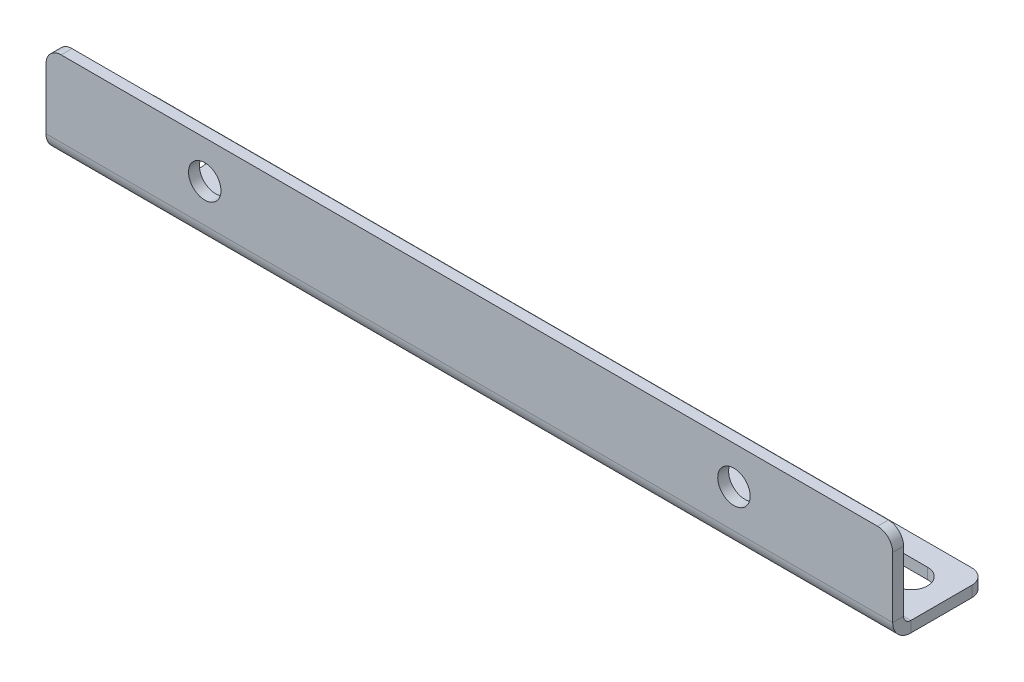
ISO-10303-21;
HEADER;
FILE_DESCRIPTION(('STEP AP214'),'2;1');
FILE_NAME('part.step','',(''),(''),'','','');
FILE_SCHEMA(('AUTOMOTIVE_DESIGN { 1 0 10303 214 1 1 1 1 }'));
ENDSEC;
DATA;
#1=APPLICATION_CONTEXT('core data for automotive mechanical design processes');
#2=APPLICATION_PROTOCOL_DEFINITION('international standard','automotive_design',2000,#1);
#3=PRODUCT_CONTEXT('',#1,'mechanical');
#4=PRODUCT('Part','Part','',(#3));
#5=PRODUCT_RELATED_PRODUCT_CATEGORY('part','',(#4));
#6=PRODUCT_DEFINITION_FORMATION('','',#4);
#7=PRODUCT_DEFINITION_CONTEXT('part definition',#1,'design');
#8=PRODUCT_DEFINITION('design','',#6,#7);
#9=PRODUCT_DEFINITION_SHAPE('','',#8);
#10=(LENGTH_UNIT() NAMED_UNIT(*) SI_UNIT(.MILLI.,.METRE.));
#11=(NAMED_UNIT(*) PLANE_ANGLE_UNIT() SI_UNIT($,.RADIAN.));
#12=(NAMED_UNIT(*) SI_UNIT($,.STERADIAN.) SOLID_ANGLE_UNIT());
#13=UNCERTAINTY_MEASURE_WITH_UNIT(LENGTH_MEASURE(1.E-05),#10,'distance_accuracy_value','');
#14=(GEOMETRIC_REPRESENTATION_CONTEXT(3) GLOBAL_UNCERTAINTY_ASSIGNED_CONTEXT((#13)) GLOBAL_UNIT_ASSIGNED_CONTEXT((#10,
#11,#12)) REPRESENTATION_CONTEXT('',''));
#15=CARTESIAN_POINT('',(0.,0.,0.));
#16=DIRECTION('',(0.,0.,1.));
#17=DIRECTION('',(1.,0.,0.));
#18=AXIS2_PLACEMENT_3D('',#15,#16,#17);
#19=CARTESIAN_POINT('',(55.5625,8.001,2.287));
#20=DIRECTION('',(0.,0.,-1.));
#21=DIRECTION('',(0.,1.,0.));
#22=AXIS2_PLACEMENT_3D('',#19,#20,#21);
#23=CYLINDRICAL_SURFACE('',#22,3.4036);
#24=CARTESIAN_POINT('',(55.5625,8.001,0.));
#25=DIRECTION('',(0.,0.,-1.));
#26=DIRECTION('',(0.,1.,0.));
#27=AXIS2_PLACEMENT_3D('',#24,#25,#26);
#28=CIRCLE('',#27,3.4036);
#29=CARTESIAN_POINT('',(55.5625,11.4046,0.));
#30=VERTEX_POINT('',#29);
#31=EDGE_CURVE('E318',#30,#30,#28,.T.);
#32=ORIENTED_EDGE('',*,*,#31,.T.);
#33=EDGE_LOOP('',(#32));
#34=FACE_BOUND('',#33,.T.);
#35=CARTESIAN_POINT('',(55.5625,8.001,2.286));
#36=DIRECTION('',(0.,0.,-1.));
#37=DIRECTION('',(0.,1.,0.));
#38=AXIS2_PLACEMENT_3D('',#35,#36,#37);
#39=CIRCLE('',#38,3.4036);
#40=CARTESIAN_POINT('',(55.5625,11.4046,2.286));
#41=VERTEX_POINT('',#40);
#42=EDGE_CURVE('E338',#41,#41,#39,.F.);
#43=ORIENTED_EDGE('',*,*,#42,.T.);
#44=EDGE_LOOP('',(#43));
#45=FACE_BOUND('',#44,.T.);
#46=ADVANCED_FACE('F40',(#34,#45),#23,.F.);
#47=CARTESIAN_POINT('',(88.9,15.9258,2.286));
#48=DIRECTION('',(0.,0.,-1.));
#49=DIRECTION('',(0.,1.,0.));
#50=AXIS2_PLACEMENT_3D('',#47,#48,#49);
#51=PLANE('',#50);
#52=CARTESIAN_POINT('',(-55.5625,8.00099999999999,2.286));
#53=DIRECTION('',(0.,0.,-1.));
#54=DIRECTION('',(0.,1.,0.));
#55=AXIS2_PLACEMENT_3D('',#52,#53,#54);
#56=CIRCLE('',#55,3.4036);
#57=CARTESIAN_POINT('',(-55.5625,11.4046,2.286));
#58=VERTEX_POINT('',#57);
#59=EDGE_CURVE('E335',#58,#58,#56,.F.);
#60=ORIENTED_EDGE('',*,*,#59,.F.);
#61=EDGE_LOOP('',(#60));
#62=FACE_BOUND('',#61,.T.);
#63=ORIENTED_EDGE('',*,*,#42,.F.);
#64=EDGE_LOOP('',(#63));
#65=FACE_BOUND('',#64,.T.);
#66=DIRECTION('',(-1.,0.,0.));
#67=VECTOR('',#66,1.);
#68=CARTESIAN_POINT('',(88.9,15.9258,2.286));
#69=LINE('',#68,#67);
#70=CARTESIAN_POINT('',(85.72,15.9258,2.286));
#71=VERTEX_POINT('',#70);
#72=CARTESIAN_POINT('',(-85.72,15.9258,2.286));
#73=VERTEX_POINT('',#72);
#74=EDGE_CURVE('E341',#71,#73,#69,.T.);
#75=ORIENTED_EDGE('',*,*,#74,.T.);
#76=CARTESIAN_POINT('',(-85.72,12.7458,2.286));
#77=DIRECTION('',(0.,0.,-1.));
#78=DIRECTION('',(0.,1.,0.));
#79=AXIS2_PLACEMENT_3D('',#76,#77,#78);
#80=CIRCLE('',#79,3.18);
#81=CARTESIAN_POINT('',(-88.9,12.7458,2.286));
#82=VERTEX_POINT('',#81);
#83=EDGE_CURVE('E343',#73,#82,#80,.F.);
#84=ORIENTED_EDGE('',*,*,#83,.T.);
#85=DIRECTION('',(0.,-1.,0.));
#86=VECTOR('',#85,1.);
#87=CARTESIAN_POINT('',(-88.9,15.9258,2.286));
#88=LINE('',#87,#86);
#89=CARTESIAN_POINT('',(-88.9,0.,2.286));
#90=VERTEX_POINT('',#89);
#91=EDGE_CURVE('E345',#82,#90,#88,.T.);
#92=ORIENTED_EDGE('',*,*,#91,.T.);
#93=DIRECTION('',(-1.,0.,0.));
#94=VECTOR('',#93,1.);
#95=CARTESIAN_POINT('',(88.9,0.,2.286));
#96=LINE('',#95,#94);
#97=CARTESIAN_POINT('',(88.9,0.,2.286));
#98=VERTEX_POINT('',#97);
#99=EDGE_CURVE('E196',#98,#90,#96,.T.);
#100=ORIENTED_EDGE('',*,*,#99,.F.);
#101=DIRECTION('',(0.,-1.,0.));
#102=VECTOR('',#101,1.);
#103=CARTESIAN_POINT('',(88.9,15.9258,2.286));
#104=LINE('',#103,#102);
#105=CARTESIAN_POINT('',(88.9,12.7458,2.286));
#106=VERTEX_POINT('',#105);
#107=EDGE_CURVE('E60',#106,#98,#104,.T.);
#108=ORIENTED_EDGE('',*,*,#107,.F.);
#109=CARTESIAN_POINT('',(85.72,12.7458,2.286));
#110=DIRECTION('',(0.,0.,-1.));
#111=DIRECTION('',(0.,1.,0.));
#112=AXIS2_PLACEMENT_3D('',#109,#110,#111);
#113=CIRCLE('',#112,3.18);
#114=EDGE_CURVE('E55',#106,#71,#113,.F.);
#115=ORIENTED_EDGE('',*,*,#114,.T.);
#116=EDGE_LOOP('',(#75,#84,#92,#100,#108,#115));
#117=FACE_BOUND('',#116,.T.);
#118=ADVANCED_FACE('F372',(#62,#65,#117),#51,.F.);
#119=CARTESIAN_POINT('',(-55.5625,8.00099999999999,2.287));
#120=DIRECTION('',(0.,0.,-1.));
#121=DIRECTION('',(0.,1.,0.));
#122=AXIS2_PLACEMENT_3D('',#119,#120,#121);
#123=CYLINDRICAL_SURFACE('',#122,3.4036);
#124=CARTESIAN_POINT('',(-55.5625,8.00099999999999,0.));
#125=DIRECTION('',(0.,0.,-1.));
#126=DIRECTION('',(0.,-1.,0.));
#127=AXIS2_PLACEMENT_3D('',#124,#125,#126);
#128=CIRCLE('',#127,3.4036);
#129=CARTESIAN_POINT('',(-55.5625,4.59739999999999,0.));
#130=VERTEX_POINT('',#129);
#131=EDGE_CURVE('E217',#130,#130,#128,.T.);
#132=ORIENTED_EDGE('',*,*,#131,.T.);
#133=EDGE_LOOP('',(#132));
#134=FACE_BOUND('',#133,.T.);
#135=ORIENTED_EDGE('',*,*,#59,.T.);
#136=EDGE_LOOP('',(#135));
#137=FACE_BOUND('',#136,.T.);
#138=ADVANCED_FACE('F395',(#134,#137),#123,.F.);
#139=CARTESIAN_POINT('',(88.9,15.9258,0.));
#140=DIRECTION('',(0.,0.,1.));
#141=DIRECTION('',(0.,-1.,0.));
#142=AXIS2_PLACEMENT_3D('',#139,#140,#141);
#143=PLANE('',#142);
#144=ORIENTED_EDGE('',*,*,#131,.F.);
#145=EDGE_LOOP('',(#144));
#146=FACE_BOUND('',#145,.T.);
#147=ORIENTED_EDGE('',*,*,#31,.F.);
#148=EDGE_LOOP('',(#147));
#149=FACE_BOUND('',#148,.T.);
#150=DIRECTION('',(0.,1.,0.));
#151=VECTOR('',#150,1.);
#152=CARTESIAN_POINT('',(-88.9,15.9258,0.));
#153=LINE('',#152,#151);
#154=CARTESIAN_POINT('',(-88.9,0.,0.));
#155=VERTEX_POINT('',#154);
#156=CARTESIAN_POINT('',(-88.9,12.7458,0.));
#157=VERTEX_POINT('',#156);
#158=EDGE_CURVE('E321',#155,#157,#153,.T.);
#159=ORIENTED_EDGE('',*,*,#158,.T.);
#160=CARTESIAN_POINT('',(-85.72,12.7458,0.));
#161=DIRECTION('',(0.,0.,1.));
#162=DIRECTION('',(0.,-1.,0.));
#163=AXIS2_PLACEMENT_3D('',#160,#161,#162);
#164=CIRCLE('',#163,3.18);
#165=CARTESIAN_POINT('',(-85.72,15.9258,0.));
#166=VERTEX_POINT('',#165);
#167=EDGE_CURVE('E323',#157,#166,#164,.F.);
#168=ORIENTED_EDGE('',*,*,#167,.T.);
#169=DIRECTION('',(-1.,0.,0.));
#170=VECTOR('',#169,1.);
#171=CARTESIAN_POINT('',(88.9,15.9258,0.));
#172=LINE('',#171,#170);
#173=CARTESIAN_POINT('',(85.72,15.9258,0.));
#174=VERTEX_POINT('',#173);
#175=EDGE_CURVE('E325',#174,#166,#172,.T.);
#176=ORIENTED_EDGE('',*,*,#175,.F.);
#177=CARTESIAN_POINT('',(85.72,12.7458,0.));
#178=DIRECTION('',(0.,0.,1.));
#179=DIRECTION('',(0.,-1.,0.));
#180=AXIS2_PLACEMENT_3D('',#177,#178,#179);
#181=CIRCLE('',#180,3.18);
#182=CARTESIAN_POINT('',(88.9,12.7458,0.));
#183=VERTEX_POINT('',#182);
#184=EDGE_CURVE('E328',#174,#183,#181,.F.);
#185=ORIENTED_EDGE('',*,*,#184,.T.);
#186=DIRECTION('',(0.,1.,0.));
#187=VECTOR('',#186,1.);
#188=CARTESIAN_POINT('',(88.9,15.9258,0.));
#189=LINE('',#188,#187);
#190=CARTESIAN_POINT('',(88.9,0.,0.));
#191=VERTEX_POINT('',#190);
#192=EDGE_CURVE('E330',#191,#183,#189,.T.);
#193=ORIENTED_EDGE('',*,*,#192,.F.);
#194=DIRECTION('',(-1.,0.,0.));
#195=VECTOR('',#194,1.);
#196=CARTESIAN_POINT('',(88.9,0.,0.));
#197=LINE('',#196,#195);
#198=EDGE_CURVE('E333',#191,#155,#197,.T.);
#199=ORIENTED_EDGE('',*,*,#198,.T.);
#200=EDGE_LOOP('',(#159,#168,#176,#185,#193,#199));
#201=FACE_BOUND('',#200,.T.);
#202=ADVANCED_FACE('F393',(#146,#149,#201),#143,.F.);
#203=CARTESIAN_POINT('',(-88.9,15.9258,-357.023646867487));
#204=DIRECTION('',(1.,0.,0.));
#205=DIRECTION('',(0.,-1.,0.));
#206=AXIS2_PLACEMENT_3D('',#203,#204,#205);
#207=PLANE('',#206);
#208=DIRECTION('',(0.,0.,1.));
#209=VECTOR('',#208,1.);
#210=CARTESIAN_POINT('',(-88.9,0.,-357.023646867487));
#211=LINE('',#210,#209);
#212=EDGE_CURVE('E351',#155,#90,#211,.T.);
#213=ORIENTED_EDGE('',*,*,#212,.T.);
#214=ORIENTED_EDGE('',*,*,#91,.F.);
#215=DIRECTION('',(0.,0.,1.));
#216=VECTOR('',#215,1.);
#217=CARTESIAN_POINT('',(-88.9,12.7458,-357.023646867487));
#218=LINE('',#217,#216);
#219=EDGE_CURVE('E11',#157,#82,#218,.T.);
#220=ORIENTED_EDGE('',*,*,#219,.F.);
#221=ORIENTED_EDGE('',*,*,#158,.F.);
#222=EDGE_LOOP('',(#213,#214,#220,#221));
#223=FACE_BOUND('',#222,.T.);
#224=ADVANCED_FACE('F42',(#223),#207,.F.);
#225=CARTESIAN_POINT('',(-85.72,12.7458,-357.023646867487));
#226=DIRECTION('',(0.,0.,1.));
#227=DIRECTION('',(0.,-1.,0.));
#228=AXIS2_PLACEMENT_3D('',#225,#226,#227);
#229=CYLINDRICAL_SURFACE('',#228,3.18);
#230=ORIENTED_EDGE('',*,*,#219,.T.);
#231=ORIENTED_EDGE('',*,*,#83,.F.);
#232=DIRECTION('',(0.,0.,1.));
#233=VECTOR('',#232,1.);
#234=CARTESIAN_POINT('',(-85.72,15.9258,-357.023646867487));
#235=LINE('',#234,#233);
#236=EDGE_CURVE('E48',#166,#73,#235,.T.);
#237=ORIENTED_EDGE('',*,*,#236,.F.);
#238=ORIENTED_EDGE('',*,*,#167,.F.);
#239=EDGE_LOOP('',(#230,#231,#237,#238));
#240=FACE_BOUND('',#239,.T.);
#241=ADVANCED_FACE('F369',(#240),#229,.T.);
#242=CARTESIAN_POINT('',(88.9,15.9258,-357.023646867487));
#243=DIRECTION('',(0.,1.,0.));
#244=DIRECTION('',(0.,0.,1.));
#245=AXIS2_PLACEMENT_3D('',#242,#243,#244);
#246=PLANE('',#245);
#247=ORIENTED_EDGE('',*,*,#74,.F.);
#248=DIRECTION('',(0.,0.,1.));
#249=VECTOR('',#248,1.);
#250=CARTESIAN_POINT('',(85.72,15.9258,-357.023646867487));
#251=LINE('',#250,#249);
#252=EDGE_CURVE('E359',#174,#71,#251,.T.);
#253=ORIENTED_EDGE('',*,*,#252,.F.);
#254=ORIENTED_EDGE('',*,*,#175,.T.);
#255=ORIENTED_EDGE('',*,*,#236,.T.);
#256=EDGE_LOOP('',(#247,#253,#254,#255));
#257=FACE_BOUND('',#256,.T.);
#258=ADVANCED_FACE('F364',(#257),#246,.T.);
#259=CARTESIAN_POINT('',(85.72,12.7458,-357.023646867487));
#260=DIRECTION('',(0.,0.,1.));
#261=DIRECTION('',(0.,-1.,0.));
#262=AXIS2_PLACEMENT_3D('',#259,#260,#261);
#263=CYLINDRICAL_SURFACE('',#262,3.18);
#264=ORIENTED_EDGE('',*,*,#252,.T.);
#265=ORIENTED_EDGE('',*,*,#114,.F.);
#266=DIRECTION('',(0.,0.,1.));
#267=VECTOR('',#266,1.);
#268=CARTESIAN_POINT('',(88.9,12.7458,-357.023646867487));
#269=LINE('',#268,#267);
#270=EDGE_CURVE('E356',#183,#106,#269,.T.);
#271=ORIENTED_EDGE('',*,*,#270,.F.);
#272=ORIENTED_EDGE('',*,*,#184,.F.);
#273=EDGE_LOOP('',(#264,#265,#271,#272));
#274=FACE_BOUND('',#273,.T.);
#275=ADVANCED_FACE('F391',(#274),#263,.T.);
#276=CARTESIAN_POINT('',(88.9,15.9258,-357.023646867487));
#277=DIRECTION('',(1.,0.,0.));
#278=DIRECTION('',(0.,-1.,0.));
#279=AXIS2_PLACEMENT_3D('',#276,#277,#278);
#280=PLANE('',#279);
#281=ORIENTED_EDGE('',*,*,#107,.T.);
#282=DIRECTION('',(0.,0.,1.));
#283=VECTOR('',#282,1.);
#284=CARTESIAN_POINT('',(88.9,0.,-357.023646867487));
#285=LINE('',#284,#283);
#286=EDGE_CURVE('E353',#191,#98,#285,.T.);
#287=ORIENTED_EDGE('',*,*,#286,.F.);
#288=ORIENTED_EDGE('',*,*,#192,.T.);
#289=ORIENTED_EDGE('',*,*,#270,.T.);
#290=EDGE_LOOP('',(#281,#287,#288,#289));
#291=FACE_BOUND('',#290,.T.);
#292=ADVANCED_FACE('F387',(#291),#280,.T.);
#293=CARTESIAN_POINT('',(85.72,355.508725377156,-14.3205999999999));
#294=DIRECTION('',(0.,-1.,0.));
#295=DIRECTION('',(0.,0.,-1.));
#296=AXIS2_PLACEMENT_3D('',#293,#294,#295);
#297=CYLINDRICAL_SURFACE('',#296,3.18);
#298=DIRECTION('',(0.,-1.,0.));
#299=VECTOR('',#298,1.);
#300=CARTESIAN_POINT('',(88.9,355.508725377156,-14.3205999999999));
#301=LINE('',#300,#299);
#302=CARTESIAN_POINT('',(88.9,-1.52399999999997,-14.3206));
#303=VERTEX_POINT('',#302);
#304=CARTESIAN_POINT('',(88.9,-3.81,-14.3206));
#305=VERTEX_POINT('',#304);
#306=EDGE_CURVE('E186',#303,#305,#301,.T.);
#307=ORIENTED_EDGE('',*,*,#306,.T.);
#308=CARTESIAN_POINT('',(85.72,-3.81,-14.3206));
#309=DIRECTION('',(0.,1.,0.));
#310=DIRECTION('',(0.,0.,1.));
#311=AXIS2_PLACEMENT_3D('',#308,#309,#310);
#312=CIRCLE('',#311,3.18);
#313=CARTESIAN_POINT('',(85.72,-3.80999999999998,-17.5006));
#314=VERTEX_POINT('',#313);
#315=EDGE_CURVE('E215',#314,#305,#312,.F.);
#316=ORIENTED_EDGE('',*,*,#315,.F.);
#317=DIRECTION('',(0.,-1.,0.));
#318=VECTOR('',#317,1.);
#319=CARTESIAN_POINT('',(85.72,355.508725377156,-17.5005999999999));
#320=LINE('',#319,#318);
#321=CARTESIAN_POINT('',(85.72,-1.524,-17.5006));
#322=VERTEX_POINT('',#321);
#323=EDGE_CURVE('E307',#322,#314,#320,.T.);
#324=ORIENTED_EDGE('',*,*,#323,.F.);
#325=CARTESIAN_POINT('',(85.72,-1.524,-14.3206));
#326=DIRECTION('',(0.,-1.,0.));
#327=DIRECTION('',(0.,0.,-1.));
#328=AXIS2_PLACEMENT_3D('',#325,#326,#327);
#329=CIRCLE('',#328,3.18);
#330=EDGE_CURVE('E228',#303,#322,#329,.F.);
#331=ORIENTED_EDGE('',*,*,#330,.F.);
#332=EDGE_LOOP('',(#307,#316,#324,#331));
#333=FACE_BOUND('',#332,.T.);
#334=ADVANCED_FACE('F417',(#333),#297,.T.);
#335=CARTESIAN_POINT('',(-85.72,355.508725377156,-14.3205999999999));
#336=DIRECTION('',(0.,-1.,0.));
#337=DIRECTION('',(0.,0.,-1.));
#338=AXIS2_PLACEMENT_3D('',#335,#336,#337);
#339=CYLINDRICAL_SURFACE('',#338,3.18);
#340=DIRECTION('',(0.,-1.,0.));
#341=VECTOR('',#340,1.);
#342=CARTESIAN_POINT('',(-85.72,355.508725377156,-17.5005999999999));
#343=LINE('',#342,#341);
#344=CARTESIAN_POINT('',(-85.72,-1.524,-17.5006));
#345=VERTEX_POINT('',#344);
#346=CARTESIAN_POINT('',(-85.72,-3.81,-17.5006));
#347=VERTEX_POINT('',#346);
#348=EDGE_CURVE('E310',#345,#347,#343,.T.);
#349=ORIENTED_EDGE('',*,*,#348,.T.);
#350=CARTESIAN_POINT('',(-85.72,-3.81,-14.3206));
#351=DIRECTION('',(0.,1.,0.));
#352=DIRECTION('',(0.,0.,1.));
#353=AXIS2_PLACEMENT_3D('',#350,#351,#352);
#354=CIRCLE('',#353,3.18);
#355=CARTESIAN_POINT('',(-88.9,-3.81,-14.3206));
#356=VERTEX_POINT('',#355);
#357=EDGE_CURVE('E207',#356,#347,#354,.F.);
#358=ORIENTED_EDGE('',*,*,#357,.F.);
#359=DIRECTION('',(0.,-1.,0.));
#360=VECTOR('',#359,1.);
#361=CARTESIAN_POINT('',(-88.9,355.508725377156,-14.3205999999999));
#362=LINE('',#361,#360);
#363=CARTESIAN_POINT('',(-88.9,-1.524,-14.3206));
#364=VERTEX_POINT('',#363);
#365=EDGE_CURVE('E204',#364,#356,#362,.T.);
#366=ORIENTED_EDGE('',*,*,#365,.F.);
#367=CARTESIAN_POINT('',(-85.72,-1.524,-14.3206));
#368=DIRECTION('',(0.,-1.,0.));
#369=DIRECTION('',(0.,0.,-1.));
#370=AXIS2_PLACEMENT_3D('',#367,#368,#369);
#371=CIRCLE('',#370,3.18);
#372=EDGE_CURVE('E233',#345,#364,#371,.F.);
#373=ORIENTED_EDGE('',*,*,#372,.F.);
#374=EDGE_LOOP('',(#349,#358,#366,#373));
#375=FACE_BOUND('',#374,.T.);
#376=ADVANCED_FACE('F444',(#375),#339,.T.);
#377=CARTESIAN_POINT('',(88.9,355.508725377156,-17.5005999999999));
#378=DIRECTION('',(0.,0.,1.));
#379=DIRECTION('',(0.,-1.,0.));
#380=AXIS2_PLACEMENT_3D('',#377,#378,#379);
#381=PLANE('',#380);
#382=ORIENTED_EDGE('',*,*,#323,.T.);
#383=DIRECTION('',(-1.,0.,0.));
#384=VECTOR('',#383,1.);
#385=CARTESIAN_POINT('',(88.9,-3.81,-17.5006));
#386=LINE('',#385,#384);
#387=EDGE_CURVE('E304',#314,#347,#386,.T.);
#388=ORIENTED_EDGE('',*,*,#387,.T.);
#389=ORIENTED_EDGE('',*,*,#348,.F.);
#390=DIRECTION('',(-1.,0.,0.));
#391=VECTOR('',#390,1.);
#392=CARTESIAN_POINT('',(88.9,-1.524,-17.5006));
#393=LINE('',#392,#391);
#394=EDGE_CURVE('E235',#322,#345,#393,.T.);
#395=ORIENTED_EDGE('',*,*,#394,.F.);
#396=EDGE_LOOP('',(#382,#388,#389,#395));
#397=FACE_BOUND('',#396,.T.);
#398=ADVANCED_FACE('F452',(#397),#381,.F.);
#399=CARTESIAN_POINT('',(71.4375,-3.811,-9.56309999999998));
#400=DIRECTION('',(0.,1.,0.));
#401=DIRECTION('',(0.,0.,1.));
#402=AXIS2_PLACEMENT_3D('',#399,#400,#401);
#403=CYLINDRICAL_SURFACE('',#402,3.4036);
#404=CARTESIAN_POINT('',(71.4375,-3.81,-9.56309999999998));
#405=DIRECTION('',(0.,1.,0.));
#406=DIRECTION('',(0.,0.,1.));
#407=AXIS2_PLACEMENT_3D('',#404,#405,#406);
#408=CIRCLE('',#407,3.4036);
#409=CARTESIAN_POINT('',(71.4375,-3.81,-6.15949999999998));
#410=VERTEX_POINT('',#409);
#411=CARTESIAN_POINT('',(71.4375,-3.81,-12.9667));
#412=VERTEX_POINT('',#411);
#413=EDGE_CURVE('E301',#410,#412,#408,.F.);
#414=ORIENTED_EDGE('',*,*,#413,.T.);
#415=DIRECTION('',(0.,1.,0.));
#416=VECTOR('',#415,1.);
#417=CARTESIAN_POINT('',(71.4375,-3.811,-12.9667));
#418=LINE('',#417,#416);
#419=CARTESIAN_POINT('',(71.4375,-1.524,-12.9667));
#420=VERTEX_POINT('',#419);
#421=EDGE_CURVE('E298',#412,#420,#418,.T.);
#422=ORIENTED_EDGE('',*,*,#421,.T.);
#423=CARTESIAN_POINT('',(71.4375,-1.524,-9.56309999999998));
#424=DIRECTION('',(0.,1.,0.));
#425=DIRECTION('',(0.,0.,1.));
#426=AXIS2_PLACEMENT_3D('',#423,#424,#425);
#427=CIRCLE('',#426,3.4036);
#428=CARTESIAN_POINT('',(71.4375,-1.524,-6.15949999999998));
#429=VERTEX_POINT('',#428);
#430=EDGE_CURVE('E295',#420,#429,#427,.T.);
#431=ORIENTED_EDGE('',*,*,#430,.T.);
#432=DIRECTION('',(0.,1.,0.));
#433=VECTOR('',#432,1.);
#434=CARTESIAN_POINT('',(71.4375,-3.811,-6.15949999999998));
#435=LINE('',#434,#433);
#436=EDGE_CURVE('E290',#410,#429,#435,.T.);
#437=ORIENTED_EDGE('',*,*,#436,.F.);
#438=EDGE_LOOP('',(#414,#422,#431,#437));
#439=FACE_BOUND('',#438,.T.);
#440=ADVANCED_FACE('F460',(#439),#403,.F.);
#441=CARTESIAN_POINT('',(71.4375,-3.811,-6.15949999999998));
#442=DIRECTION('',(0.,0.,1.));
#443=DIRECTION('',(0.,-1.,0.));
#444=AXIS2_PLACEMENT_3D('',#441,#442,#443);
#445=PLANE('',#444);
#446=DIRECTION('',(-1.,0.,0.));
#447=VECTOR('',#446,1.);
#448=CARTESIAN_POINT('',(71.4375,-3.81,-6.15949999999998));
#449=LINE('',#448,#447);
#450=CARTESIAN_POINT('',(80.9625,-3.81,-6.15949999999998));
#451=VERTEX_POINT('',#450);
#452=EDGE_CURVE('E293',#451,#410,#449,.T.);
#453=ORIENTED_EDGE('',*,*,#452,.T.);
#454=ORIENTED_EDGE('',*,*,#436,.T.);
#455=DIRECTION('',(1.,0.,0.));
#456=VECTOR('',#455,1.);
#457=CARTESIAN_POINT('',(71.4375,-1.524,-6.15949999999998));
#458=LINE('',#457,#456);
#459=CARTESIAN_POINT('',(80.9625,-1.524,-6.15949999999998));
#460=VERTEX_POINT('',#459);
#461=EDGE_CURVE('E287',#429,#460,#458,.T.);
#462=ORIENTED_EDGE('',*,*,#461,.T.);
#463=DIRECTION('',(0.,1.,0.));
#464=VECTOR('',#463,1.);
#465=CARTESIAN_POINT('',(80.9625,-3.811,-6.15949999999998));
#466=LINE('',#465,#464);
#467=EDGE_CURVE('E281',#451,#460,#466,.T.);
#468=ORIENTED_EDGE('',*,*,#467,.F.);
#469=EDGE_LOOP('',(#453,#454,#462,#468));
#470=FACE_BOUND('',#469,.T.);
#471=ADVANCED_FACE('F468',(#470),#445,.F.);
#472=CARTESIAN_POINT('',(80.9625,-3.811,-9.56309999999998));
#473=DIRECTION('',(0.,1.,0.));
#474=DIRECTION('',(0.,0.,1.));
#475=AXIS2_PLACEMENT_3D('',#472,#473,#474);
#476=CYLINDRICAL_SURFACE('',#475,3.4036);
#477=CARTESIAN_POINT('',(80.9625,-3.81,-9.56309999999998));
#478=DIRECTION('',(0.,1.,0.));
#479=DIRECTION('',(0.,0.,1.));
#480=AXIS2_PLACEMENT_3D('',#477,#478,#479);
#481=CIRCLE('',#480,3.4036);
#482=CARTESIAN_POINT('',(80.9625,-3.81,-12.9667));
#483=VERTEX_POINT('',#482);
#484=EDGE_CURVE('E284',#483,#451,#481,.F.);
#485=ORIENTED_EDGE('',*,*,#484,.T.);
#486=ORIENTED_EDGE('',*,*,#467,.T.);
#487=CARTESIAN_POINT('',(80.9625,-1.524,-9.56309999999998));
#488=DIRECTION('',(0.,1.,0.));
#489=DIRECTION('',(0.,0.,1.));
#490=AXIS2_PLACEMENT_3D('',#487,#488,#489);
#491=CIRCLE('',#490,3.4036);
#492=CARTESIAN_POINT('',(80.9625,-1.524,-12.9667));
#493=VERTEX_POINT('',#492);
#494=EDGE_CURVE('E278',#460,#493,#491,.T.);
#495=ORIENTED_EDGE('',*,*,#494,.T.);
#496=DIRECTION('',(0.,1.,0.));
#497=VECTOR('',#496,1.);
#498=CARTESIAN_POINT('',(80.9625,-3.811,-12.9667));
#499=LINE('',#498,#497);
#500=EDGE_CURVE('E272',#483,#493,#499,.T.);
#501=ORIENTED_EDGE('',*,*,#500,.F.);
#502=EDGE_LOOP('',(#485,#486,#495,#501));
#503=FACE_BOUND('',#502,.T.);
#504=ADVANCED_FACE('F476',(#503),#476,.F.);
#505=CARTESIAN_POINT('',(80.9625,-3.811,-12.9667));
#506=DIRECTION('',(0.,0.,-1.));
#507=DIRECTION('',(-1.,0.,0.));
#508=AXIS2_PLACEMENT_3D('',#505,#506,#507);
#509=PLANE('',#508);
#510=DIRECTION('',(1.,0.,0.));
#511=VECTOR('',#510,1.);
#512=CARTESIAN_POINT('',(80.9625,-3.81,-12.9667));
#513=LINE('',#512,#511);
#514=EDGE_CURVE('E275',#412,#483,#513,.T.);
#515=ORIENTED_EDGE('',*,*,#514,.T.);
#516=ORIENTED_EDGE('',*,*,#500,.T.);
#517=DIRECTION('',(-1.,0.,0.));
#518=VECTOR('',#517,1.);
#519=CARTESIAN_POINT('',(80.9625,-1.524,-12.9667));
#520=LINE('',#519,#518);
#521=EDGE_CURVE('E270',#493,#420,#520,.T.);
#522=ORIENTED_EDGE('',*,*,#521,.T.);
#523=ORIENTED_EDGE('',*,*,#421,.F.);
#524=EDGE_LOOP('',(#515,#516,#522,#523));
#525=FACE_BOUND('',#524,.T.);
#526=ADVANCED_FACE('F484',(#525),#509,.F.);
#527=CARTESIAN_POINT('',(-80.9625,-3.811,-9.56309999999998));
#528=DIRECTION('',(0.,1.,0.));
#529=DIRECTION('',(0.,0.,1.));
#530=AXIS2_PLACEMENT_3D('',#527,#528,#529);
#531=CYLINDRICAL_SURFACE('',#530,3.4036);
#532=CARTESIAN_POINT('',(-80.9625,-3.81,-9.56309999999998));
#533=DIRECTION('',(0.,1.,0.));
#534=DIRECTION('',(0.,0.,1.));
#535=AXIS2_PLACEMENT_3D('',#532,#533,#534);
#536=CIRCLE('',#535,3.4036);
#537=CARTESIAN_POINT('',(-80.9625,-3.81,-6.15949999999998));
#538=VERTEX_POINT('',#537);
#539=CARTESIAN_POINT('',(-80.9625,-3.81,-12.9667));
#540=VERTEX_POINT('',#539);
#541=EDGE_CURVE('E267',#538,#540,#536,.F.);
#542=ORIENTED_EDGE('',*,*,#541,.T.);
#543=DIRECTION('',(0.,1.,0.));
#544=VECTOR('',#543,1.);
#545=CARTESIAN_POINT('',(-80.9625,-3.811,-12.9667));
#546=LINE('',#545,#544);
#547=CARTESIAN_POINT('',(-80.9625,-1.524,-12.9667));
#548=VERTEX_POINT('',#547);
#549=EDGE_CURVE('E264',#540,#548,#546,.T.);
#550=ORIENTED_EDGE('',*,*,#549,.T.);
#551=CARTESIAN_POINT('',(-80.9625,-1.524,-9.56309999999998));
#552=DIRECTION('',(0.,1.,0.));
#553=DIRECTION('',(0.,0.,-1.));
#554=AXIS2_PLACEMENT_3D('',#551,#552,#553);
#555=CIRCLE('',#554,3.4036);
#556=CARTESIAN_POINT('',(-80.9625,-1.524,-6.15949999999998));
#557=VERTEX_POINT('',#556);
#558=EDGE_CURVE('E261',#548,#557,#555,.T.);
#559=ORIENTED_EDGE('',*,*,#558,.T.);
#560=DIRECTION('',(0.,1.,0.));
#561=VECTOR('',#560,1.);
#562=CARTESIAN_POINT('',(-80.9625,-3.811,-6.15949999999998));
#563=LINE('',#562,#561);
#564=EDGE_CURVE('E256',#538,#557,#563,.T.);
#565=ORIENTED_EDGE('',*,*,#564,.F.);
#566=EDGE_LOOP('',(#542,#550,#559,#565));
#567=FACE_BOUND('',#566,.T.);
#568=ADVANCED_FACE('F492',(#567),#531,.F.);
#569=CARTESIAN_POINT('',(-71.4375,-3.811,-6.15949999999998));
#570=DIRECTION('',(0.,0.,1.));
#571=DIRECTION('',(0.,-1.,0.));
#572=AXIS2_PLACEMENT_3D('',#569,#570,#571);
#573=PLANE('',#572);
#574=DIRECTION('',(-1.,0.,0.));
#575=VECTOR('',#574,1.);
#576=CARTESIAN_POINT('',(-71.4375,-3.81,-6.15949999999998));
#577=LINE('',#576,#575);
#578=CARTESIAN_POINT('',(-71.4375,-3.81,-6.15949999999998));
#579=VERTEX_POINT('',#578);
#580=EDGE_CURVE('E259',#579,#538,#577,.T.);
#581=ORIENTED_EDGE('',*,*,#580,.T.);
#582=ORIENTED_EDGE('',*,*,#564,.T.);
#583=DIRECTION('',(1.,0.,0.));
#584=VECTOR('',#583,1.);
#585=CARTESIAN_POINT('',(-71.4375,-1.524,-6.15949999999998));
#586=LINE('',#585,#584);
#587=CARTESIAN_POINT('',(-71.4375,-1.524,-6.15949999999998));
#588=VERTEX_POINT('',#587);
#589=EDGE_CURVE('E253',#557,#588,#586,.T.);
#590=ORIENTED_EDGE('',*,*,#589,.T.);
#591=DIRECTION('',(0.,1.,0.));
#592=VECTOR('',#591,1.);
#593=CARTESIAN_POINT('',(-71.4375,-3.811,-6.15949999999998));
#594=LINE('',#593,#592);
#595=EDGE_CURVE('E247',#579,#588,#594,.T.);
#596=ORIENTED_EDGE('',*,*,#595,.F.);
#597=EDGE_LOOP('',(#581,#582,#590,#596));
#598=FACE_BOUND('',#597,.T.);
#599=ADVANCED_FACE('F500',(#598),#573,.F.);
#600=CARTESIAN_POINT('',(-71.4375,-3.811,-9.56309999999998));
#601=DIRECTION('',(0.,1.,0.));
#602=DIRECTION('',(0.,0.,1.));
#603=AXIS2_PLACEMENT_3D('',#600,#601,#602);
#604=CYLINDRICAL_SURFACE('',#603,3.4036);
#605=CARTESIAN_POINT('',(-71.4375,-3.81,-9.56309999999998));
#606=DIRECTION('',(0.,1.,0.));
#607=DIRECTION('',(0.,0.,1.));
#608=AXIS2_PLACEMENT_3D('',#605,#606,#607);
#609=CIRCLE('',#608,3.4036);
#610=CARTESIAN_POINT('',(-71.4375,-3.81,-12.9667));
#611=VERTEX_POINT('',#610);
#612=EDGE_CURVE('E250',#611,#579,#609,.F.);
#613=ORIENTED_EDGE('',*,*,#612,.T.);
#614=ORIENTED_EDGE('',*,*,#595,.T.);
#615=CARTESIAN_POINT('',(-71.4375,-1.524,-9.56309999999998));
#616=DIRECTION('',(0.,1.,0.));
#617=DIRECTION('',(0.,0.,-1.));
#618=AXIS2_PLACEMENT_3D('',#615,#616,#617);
#619=CIRCLE('',#618,3.4036);
#620=CARTESIAN_POINT('',(-71.4375,-1.524,-12.9667));
#621=VERTEX_POINT('',#620);
#622=EDGE_CURVE('E244',#588,#621,#619,.T.);
#623=ORIENTED_EDGE('',*,*,#622,.T.);
#624=DIRECTION('',(0.,1.,0.));
#625=VECTOR('',#624,1.);
#626=CARTESIAN_POINT('',(-71.4375,-3.811,-12.9667));
#627=LINE('',#626,#625);
#628=EDGE_CURVE('E239',#611,#621,#627,.T.);
#629=ORIENTED_EDGE('',*,*,#628,.F.);
#630=EDGE_LOOP('',(#613,#614,#623,#629));
#631=FACE_BOUND('',#630,.T.);
#632=ADVANCED_FACE('F508',(#631),#604,.F.);
#633=CARTESIAN_POINT('',(-80.9625,-3.811,-12.9667));
#634=DIRECTION('',(0.,0.,-1.));
#635=DIRECTION('',(-1.,0.,0.));
#636=AXIS2_PLACEMENT_3D('',#633,#634,#635);
#637=PLANE('',#636);
#638=DIRECTION('',(1.,0.,0.));
#639=VECTOR('',#638,1.);
#640=CARTESIAN_POINT('',(-80.9625,-3.81,-12.9667));
#641=LINE('',#640,#639);
#642=EDGE_CURVE('E242',#540,#611,#641,.T.);
#643=ORIENTED_EDGE('',*,*,#642,.T.);
#644=ORIENTED_EDGE('',*,*,#628,.T.);
#645=DIRECTION('',(-1.,0.,0.));
#646=VECTOR('',#645,1.);
#647=CARTESIAN_POINT('',(-80.9625,-1.524,-12.9667));
#648=LINE('',#647,#646);
#649=EDGE_CURVE('E237',#621,#548,#648,.T.);
#650=ORIENTED_EDGE('',*,*,#649,.T.);
#651=ORIENTED_EDGE('',*,*,#549,.F.);
#652=EDGE_LOOP('',(#643,#644,#650,#651));
#653=FACE_BOUND('',#652,.T.);
#654=ADVANCED_FACE('F516',(#653),#637,.F.);
#655=CARTESIAN_POINT('',(88.9,-1.524,-17.5006));
#656=DIRECTION('',(0.,-1.,0.));
#657=DIRECTION('',(0.,0.,-1.));
#658=AXIS2_PLACEMENT_3D('',#655,#656,#657);
#659=PLANE('',#658);
#660=ORIENTED_EDGE('',*,*,#649,.F.);
#661=ORIENTED_EDGE('',*,*,#622,.F.);
#662=ORIENTED_EDGE('',*,*,#589,.F.);
#663=ORIENTED_EDGE('',*,*,#558,.F.);
#664=EDGE_LOOP('',(#660,#661,#662,#663));
#665=FACE_BOUND('',#664,.T.);
#666=ORIENTED_EDGE('',*,*,#521,.F.);
#667=ORIENTED_EDGE('',*,*,#494,.F.);
#668=ORIENTED_EDGE('',*,*,#461,.F.);
#669=ORIENTED_EDGE('',*,*,#430,.F.);
#670=EDGE_LOOP('',(#666,#667,#668,#669));
#671=FACE_BOUND('',#670,.T.);
#672=ORIENTED_EDGE('',*,*,#394,.T.);
#673=ORIENTED_EDGE('',*,*,#372,.T.);
#674=DIRECTION('',(0.,0.,1.));
#675=VECTOR('',#674,1.);
#676=CARTESIAN_POINT('',(-88.9,-1.524,-17.5006));
#677=LINE('',#676,#675);
#678=CARTESIAN_POINT('',(-88.9,-1.524,-1.524));
#679=VERTEX_POINT('',#678);
#680=EDGE_CURVE('E230',#364,#679,#677,.T.);
#681=ORIENTED_EDGE('',*,*,#680,.T.);
#682=DIRECTION('',(-1.,0.,0.));
#683=VECTOR('',#682,1.);
#684=CARTESIAN_POINT('',(88.9,-1.524,-1.524));
#685=LINE('',#684,#683);
#686=CARTESIAN_POINT('',(88.9,-1.524,-1.524));
#687=VERTEX_POINT('',#686);
#688=EDGE_CURVE('E187',#687,#679,#685,.T.);
#689=ORIENTED_EDGE('',*,*,#688,.F.);
#690=DIRECTION('',(0.,0.,1.));
#691=VECTOR('',#690,1.);
#692=CARTESIAN_POINT('',(88.9,-1.524,-17.5006));
#693=LINE('',#692,#691);
#694=EDGE_CURVE('E224',#303,#687,#693,.T.);
#695=ORIENTED_EDGE('',*,*,#694,.F.);
#696=ORIENTED_EDGE('',*,*,#330,.T.);
#697=EDGE_LOOP('',(#672,#673,#681,#689,#695,#696));
#698=FACE_BOUND('',#697,.T.);
#699=ADVANCED_FACE('F524',(#665,#671,#698),#659,.F.);
#700=CARTESIAN_POINT('',(88.9,355.508725377156,-17.5005999999999));
#701=DIRECTION('',(1.,0.,0.));
#702=DIRECTION('',(0.,0.,-1.));
#703=AXIS2_PLACEMENT_3D('',#700,#701,#702);
#704=PLANE('',#703);
#705=DIRECTION('',(0.,0.,-1.));
#706=VECTOR('',#705,1.);
#707=CARTESIAN_POINT('',(88.9,-3.81,-1.524));
#708=LINE('',#707,#706);
#709=CARTESIAN_POINT('',(88.9,-3.81,-1.524));
#710=VERTEX_POINT('',#709);
#711=EDGE_CURVE('E213',#710,#305,#708,.T.);
#712=ORIENTED_EDGE('',*,*,#711,.T.);
#713=ORIENTED_EDGE('',*,*,#306,.F.);
#714=ORIENTED_EDGE('',*,*,#694,.T.);
#715=DIRECTION('',(0.,-1.,0.));
#716=VECTOR('',#715,1.);
#717=CARTESIAN_POINT('',(88.9,355.508725377156,-1.52399999999996));
#718=LINE('',#717,#716);
#719=EDGE_CURVE('E208',#687,#710,#718,.T.);
#720=ORIENTED_EDGE('',*,*,#719,.T.);
#721=EDGE_LOOP('',(#712,#713,#714,#720));
#722=FACE_BOUND('',#721,.T.);
#723=ADVANCED_FACE('F532',(#722),#704,.T.);
#724=CARTESIAN_POINT('',(88.9,-3.81,-1.524));
#725=DIRECTION('',(0.,1.,0.));
#726=DIRECTION('',(0.,0.,1.));
#727=AXIS2_PLACEMENT_3D('',#724,#725,#726);
#728=PLANE('',#727);
#729=ORIENTED_EDGE('',*,*,#580,.F.);
#730=ORIENTED_EDGE('',*,*,#612,.F.);
#731=ORIENTED_EDGE('',*,*,#642,.F.);
#732=ORIENTED_EDGE('',*,*,#541,.F.);
#733=EDGE_LOOP('',(#729,#730,#731,#732));
#734=FACE_BOUND('',#733,.T.);
#735=ORIENTED_EDGE('',*,*,#452,.F.);
#736=ORIENTED_EDGE('',*,*,#484,.F.);
#737=ORIENTED_EDGE('',*,*,#514,.F.);
#738=ORIENTED_EDGE('',*,*,#413,.F.);
#739=EDGE_LOOP('',(#735,#736,#737,#738));
#740=FACE_BOUND('',#739,.T.);
#741=DIRECTION('',(0.,0.,-1.));
#742=VECTOR('',#741,1.);
#743=CARTESIAN_POINT('',(-88.9,-3.81,-1.524));
#744=LINE('',#743,#742);
#745=CARTESIAN_POINT('',(-88.9,-3.81,-1.524));
#746=VERTEX_POINT('',#745);
#747=EDGE_CURVE('E201',#746,#356,#744,.T.);
#748=ORIENTED_EDGE('',*,*,#747,.T.);
#749=ORIENTED_EDGE('',*,*,#357,.T.);
#750=ORIENTED_EDGE('',*,*,#387,.F.);
#751=ORIENTED_EDGE('',*,*,#315,.T.);
#752=ORIENTED_EDGE('',*,*,#711,.F.);
#753=DIRECTION('',(-1.,0.,0.));
#754=VECTOR('',#753,1.);
#755=CARTESIAN_POINT('',(88.9,-3.81,-1.524));
#756=LINE('',#755,#754);
#757=EDGE_CURVE('E194',#710,#746,#756,.T.);
#758=ORIENTED_EDGE('',*,*,#757,.T.);
#759=EDGE_LOOP('',(#748,#749,#750,#751,#752,#758));
#760=FACE_BOUND('',#759,.T.);
#761=ADVANCED_FACE('F211',(#734,#740,#760),#728,.F.);
#762=CARTESIAN_POINT('',(-88.9,355.508725377156,-17.5005999999999));
#763=DIRECTION('',(1.,0.,0.));
#764=DIRECTION('',(0.,0.,-1.));
#765=AXIS2_PLACEMENT_3D('',#762,#763,#764);
#766=PLANE('',#765);
#767=ORIENTED_EDGE('',*,*,#365,.T.);
#768=ORIENTED_EDGE('',*,*,#747,.F.);
#769=DIRECTION('',(0.,-1.,0.));
#770=VECTOR('',#769,1.);
#771=CARTESIAN_POINT('',(-88.9,355.508725377156,-1.52399999999996));
#772=LINE('',#771,#770);
#773=EDGE_CURVE('E175',#679,#746,#772,.T.);
#774=ORIENTED_EDGE('',*,*,#773,.F.);
#775=ORIENTED_EDGE('',*,*,#680,.F.);
#776=EDGE_LOOP('',(#767,#768,#774,#775));
#777=FACE_BOUND('',#776,.T.);
#778=ADVANCED_FACE('F202',(#777),#766,.F.);
#779=CARTESIAN_POINT('',(-88.9,0.,-1.524));
#780=DIRECTION('',(-1.,0.,0.));
#781=DIRECTION('',(0.,-1.,0.));
#782=AXIS2_PLACEMENT_3D('',#779,#780,#781);
#783=PLANE('',#782);
#784=ORIENTED_EDGE('',*,*,#212,.F.);
#785=CARTESIAN_POINT('',(-88.9,0.,-1.524));
#786=DIRECTION('',(1.,0.,0.));
#787=DIRECTION('',(0.,0.,-1.));
#788=AXIS2_PLACEMENT_3D('',#785,#786,#787);
#789=CIRCLE('',#788,1.524);
#790=EDGE_CURVE('E181',#155,#679,#789,.T.);
#791=ORIENTED_EDGE('',*,*,#790,.T.);
#792=ORIENTED_EDGE('',*,*,#773,.T.);
#793=CARTESIAN_POINT('',(-88.9,0.,-1.524));
#794=DIRECTION('',(1.,0.,0.));
#795=DIRECTION('',(0.,0.,-1.));
#796=AXIS2_PLACEMENT_3D('',#793,#794,#795);
#797=CIRCLE('',#796,3.81);
#798=EDGE_CURVE('E179',#90,#746,#797,.T.);
#799=ORIENTED_EDGE('',*,*,#798,.F.);
#800=EDGE_LOOP('',(#784,#791,#792,#799));
#801=FACE_BOUND('',#800,.T.);
#802=ADVANCED_FACE('F178',(#801),#783,.T.);
#803=CARTESIAN_POINT('',(88.9,0.,-1.524));
#804=DIRECTION('',(1.,0.,0.));
#805=DIRECTION('',(0.,1.,0.));
#806=AXIS2_PLACEMENT_3D('',#803,#804,#805);
#807=PLANE('',#806);
#808=CARTESIAN_POINT('',(88.9,0.,-1.524));
#809=DIRECTION('',(1.,0.,0.));
#810=DIRECTION('',(0.,0.,-1.));
#811=AXIS2_PLACEMENT_3D('',#808,#809,#810);
#812=CIRCLE('',#811,1.524);
#813=EDGE_CURVE('E198',#687,#191,#812,.F.);
#814=ORIENTED_EDGE('',*,*,#813,.T.);
#815=ORIENTED_EDGE('',*,*,#286,.T.);
#816=CARTESIAN_POINT('',(88.9,0.,-1.524));
#817=DIRECTION('',(1.,0.,0.));
#818=DIRECTION('',(0.,0.,-1.));
#819=AXIS2_PLACEMENT_3D('',#816,#817,#818);
#820=CIRCLE('',#819,3.81);
#821=EDGE_CURVE('E197',#710,#98,#820,.F.);
#822=ORIENTED_EDGE('',*,*,#821,.F.);
#823=ORIENTED_EDGE('',*,*,#719,.F.);
#824=EDGE_LOOP('',(#814,#815,#822,#823));
#825=FACE_BOUND('',#824,.T.);
#826=ADVANCED_FACE('F384',(#825),#807,.T.);
#827=CARTESIAN_POINT('',(-270.340562171964,0.,-1.524));
#828=DIRECTION('',(1.,0.,0.));
#829=DIRECTION('',(0.,0.,-1.));
#830=AXIS2_PLACEMENT_3D('',#827,#828,#829);
#831=CYLINDRICAL_SURFACE('',#830,3.81);
#832=ORIENTED_EDGE('',*,*,#757,.F.);
#833=ORIENTED_EDGE('',*,*,#821,.T.);
#834=ORIENTED_EDGE('',*,*,#99,.T.);
#835=ORIENTED_EDGE('',*,*,#798,.T.);
#836=EDGE_LOOP('',(#832,#833,#834,#835));
#837=FACE_BOUND('',#836,.T.);
#838=ADVANCED_FACE('F191',(#837),#831,.T.);
#839=CARTESIAN_POINT('',(-270.340562171964,0.,-1.524));
#840=DIRECTION('',(1.,0.,0.));
#841=DIRECTION('',(0.,0.,-1.));
#842=AXIS2_PLACEMENT_3D('',#839,#840,#841);
#843=CYLINDRICAL_SURFACE('',#842,1.524);
#844=ORIENTED_EDGE('',*,*,#688,.T.);
#845=ORIENTED_EDGE('',*,*,#790,.F.);
#846=ORIENTED_EDGE('',*,*,#198,.F.);
#847=ORIENTED_EDGE('',*,*,#813,.F.);
#848=EDGE_LOOP('',(#844,#845,#846,#847));
#849=FACE_BOUND('',#848,.T.);
#850=ADVANCED_FACE('F377',(#849),#843,.F.);
#851=CLOSED_SHELL('',(#46,#118,#138,#202,#224,#241,#258,#275,#292,#334,#376,#398,#440,#471,#504,
#526,#568,#599,#632,#654,#699,#723,#761,#778,#802,#826,#838,#850));
#852=MANIFOLD_SOLID_BREP('B2',#851);
#853=ADVANCED_BREP_SHAPE_REPRESENTATION('',(#18,#852),#14);
#854=SHAPE_DEFINITION_REPRESENTATION(#9,#853);
ENDSEC;
END-ISO-10303-21;
